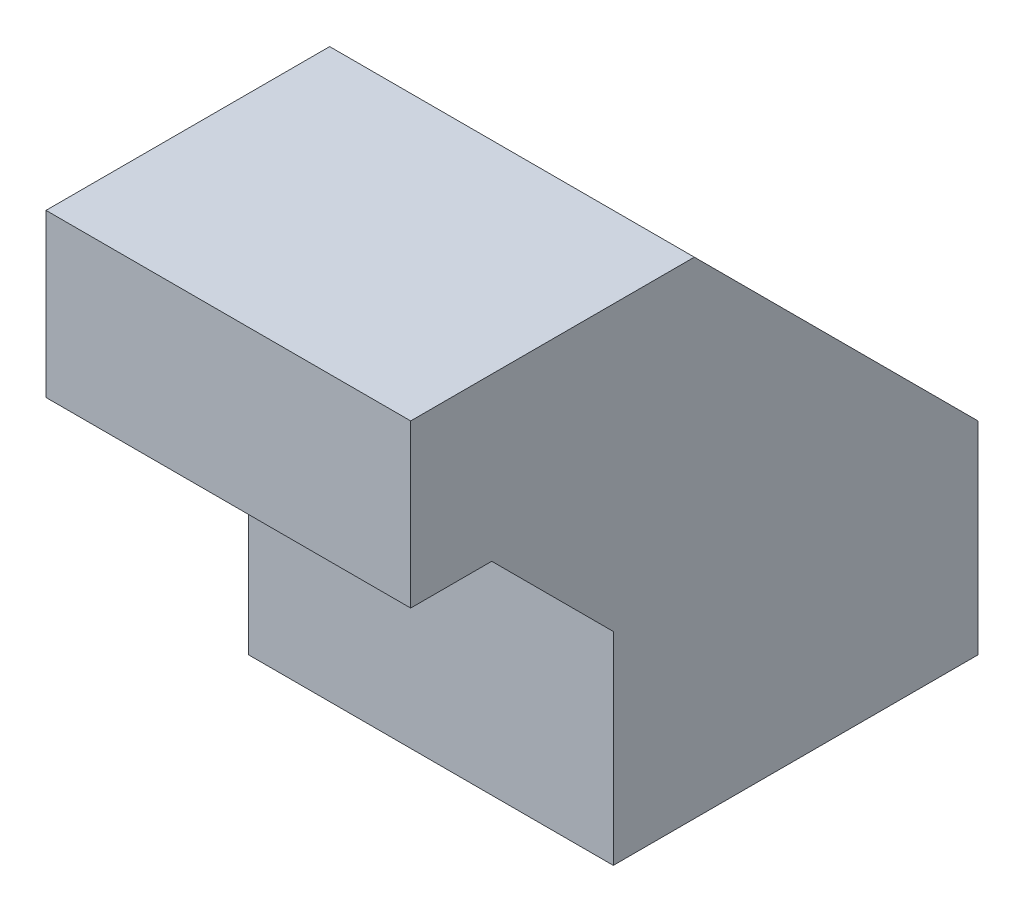
ISO-10303-21;
HEADER;
FILE_DESCRIPTION(('STEP AP214'),'2;1');
FILE_NAME('part.step','',(''),(''),'','','');
FILE_SCHEMA(('AUTOMOTIVE_DESIGN { 1 0 10303 214 1 1 1 1 }'));
ENDSEC;
DATA;
#1=APPLICATION_CONTEXT('core data for automotive mechanical design processes');
#2=APPLICATION_PROTOCOL_DEFINITION('international standard','automotive_design',2000,#1);
#3=PRODUCT_CONTEXT('',#1,'mechanical');
#4=PRODUCT('Part','Part','',(#3));
#5=PRODUCT_RELATED_PRODUCT_CATEGORY('part','',(#4));
#6=PRODUCT_DEFINITION_FORMATION('','',#4);
#7=PRODUCT_DEFINITION_CONTEXT('part definition',#1,'design');
#8=PRODUCT_DEFINITION('design','',#6,#7);
#9=PRODUCT_DEFINITION_SHAPE('','',#8);
#10=(LENGTH_UNIT() NAMED_UNIT(*) SI_UNIT(.MILLI.,.METRE.));
#11=(NAMED_UNIT(*) PLANE_ANGLE_UNIT() SI_UNIT($,.RADIAN.));
#12=(NAMED_UNIT(*) SI_UNIT($,.STERADIAN.) SOLID_ANGLE_UNIT());
#13=UNCERTAINTY_MEASURE_WITH_UNIT(LENGTH_MEASURE(1.E-05),#10,'distance_accuracy_value','');
#14=(GEOMETRIC_REPRESENTATION_CONTEXT(3) GLOBAL_UNCERTAINTY_ASSIGNED_CONTEXT((#13)) GLOBAL_UNIT_ASSIGNED_CONTEXT((#10,
#11,#12)) REPRESENTATION_CONTEXT('',''));
#15=CARTESIAN_POINT('',(0.,0.,0.));
#16=DIRECTION('',(0.,0.,1.));
#17=DIRECTION('',(1.,0.,0.));
#18=AXIS2_PLACEMENT_3D('',#15,#16,#17);
#19=CARTESIAN_POINT('',(0.,25.,0.));
#20=DIRECTION('',(0.,-1.,0.));
#21=DIRECTION('',(0.,0.,-1.));
#22=AXIS2_PLACEMENT_3D('',#19,#20,#21);
#23=CYLINDRICAL_SURFACE('',#22,20.);
#24=CARTESIAN_POINT('',(0.,0.,0.));
#25=DIRECTION('',(0.,1.,0.));
#26=DIRECTION('',(0.,0.,1.));
#27=AXIS2_PLACEMENT_3D('',#24,#25,#26);
#28=CIRCLE('',#27,20.);
#29=CARTESIAN_POINT('',(0.,0.,20.));
#30=VERTEX_POINT('',#29);
#31=EDGE_CURVE('E181',#30,#30,#28,.T.);
#32=ORIENTED_EDGE('',*,*,#31,.F.);
#33=EDGE_LOOP('',(#32));
#34=FACE_BOUND('',#33,.T.);
#35=CARTESIAN_POINT('',(0.,16.3873016277919,0.));
#36=DIRECTION('',(0.,0.707106781186548,-0.707106781186548));
#37=DIRECTION('',(0.,-0.707106781186548,-0.707106781186548));
#38=AXIS2_PLACEMENT_3D('',#35,#36,#37);
#39=ELLIPSE('',#38,28.2842712474619,20.);
#40=CARTESIAN_POINT('',(-18.8159302335193,9.60786437626905,-6.77943725152286));
#41=VERTEX_POINT('',#40);
#42=CARTESIAN_POINT('',(-20.,16.3873016277919,0.));
#43=VERTEX_POINT('',#42);
#44=EDGE_CURVE('E387',#41,#43,#39,.T.);
#45=ORIENTED_EDGE('',*,*,#44,.T.);
#46=CARTESIAN_POINT('',(-18.0505242790719,25.,8.61269837220809));
#47=VERTEX_POINT('',#46);
#48=EDGE_CURVE('E173',#43,#47,#39,.T.);
#49=ORIENTED_EDGE('',*,*,#48,.T.);
#50=CARTESIAN_POINT('',(0.,25.,0.));
#51=DIRECTION('',(0.,1.,0.));
#52=DIRECTION('',(0.,0.,1.));
#53=AXIS2_PLACEMENT_3D('',#50,#51,#52);
#54=CIRCLE('',#53,20.);
#55=CARTESIAN_POINT('',(18.0505242790719,25.,8.61269837220809));
#56=VERTEX_POINT('',#55);
#57=EDGE_CURVE('E182',#47,#56,#54,.T.);
#58=ORIENTED_EDGE('',*,*,#57,.T.);
#59=CARTESIAN_POINT('',(20.,16.3873016277919,0.));
#60=VERTEX_POINT('',#59);
#61=EDGE_CURVE('E55',#56,#60,#39,.T.);
#62=ORIENTED_EDGE('',*,*,#61,.T.);
#63=CARTESIAN_POINT('',(18.8159302335193,9.60786437626905,-6.77943725152286));
#64=VERTEX_POINT('',#63);
#65=EDGE_CURVE('E175',#60,#64,#39,.T.);
#66=ORIENTED_EDGE('',*,*,#65,.T.);
#67=CARTESIAN_POINT('',(0.,2.82842712474619,0.));
#68=DIRECTION('',(0.,0.707106781186547,0.707106781186548));
#69=DIRECTION('',(0.,-0.707106781186548,0.707106781186547));
#70=AXIS2_PLACEMENT_3D('',#67,#68,#69);
#71=ELLIPSE('',#70,28.2842712474619,20.);
#72=EDGE_CURVE('E11',#64,#41,#71,.T.);
#73=ORIENTED_EDGE('',*,*,#72,.T.);
#74=EDGE_LOOP('',(#45,#49,#58,#62,#66,#73));
#75=FACE_BOUND('',#74,.T.);
#76=ADVANCED_FACE('F33',(#34,#75),#23,.F.);
#77=CARTESIAN_POINT('',(0.,25.,0.));
#78=DIRECTION('',(0.,1.,0.));
#79=DIRECTION('',(0.,0.,1.));
#80=AXIS2_PLACEMENT_3D('',#77,#78,#79);
#81=PLANE('',#80);
#82=DIRECTION('',(-1.,0.,0.));
#83=VECTOR('',#82,1.);
#84=CARTESIAN_POINT('',(0.,25.,8.61269837220809));
#85=LINE('',#84,#83);
#86=EDGE_CURVE('E282',#56,#47,#85,.T.);
#87=ORIENTED_EDGE('',*,*,#86,.F.);
#88=ORIENTED_EDGE('',*,*,#57,.F.);
#89=EDGE_LOOP('',(#87,#88));
#90=FACE_BOUND('',#89,.T.);
#91=ADVANCED_FACE('F292',(#90),#81,.F.);
#92=CARTESIAN_POINT('',(22.5,40.,-22.5));
#93=DIRECTION('',(-1.,0.,0.));
#94=DIRECTION('',(0.,0.,1.));
#95=AXIS2_PLACEMENT_3D('',#92,#93,#94);
#96=PLANE('',#95);
#97=DIRECTION('',(0.,-1.,0.));
#98=VECTOR('',#97,1.);
#99=CARTESIAN_POINT('',(22.5,40.,-22.5));
#100=LINE('',#99,#98);
#101=CARTESIAN_POINT('',(22.5,24.9999999999999,-22.5));
#102=VERTEX_POINT('',#101);
#103=CARTESIAN_POINT('',(22.5,0.,-22.5));
#104=VERTEX_POINT('',#103);
#105=EDGE_CURVE('E211',#102,#104,#100,.T.);
#106=ORIENTED_EDGE('',*,*,#105,.F.);
#107=DIRECTION('',(0.,0.707106781186549,0.707106781186546));
#108=VECTOR('',#107,1.);
#109=CARTESIAN_POINT('',(22.5,60.,12.5));
#110=LINE('',#109,#108);
#111=CARTESIAN_POINT('',(22.5,60.,12.5));
#112=VERTEX_POINT('',#111);
#113=EDGE_CURVE('E280',#102,#112,#110,.T.);
#114=ORIENTED_EDGE('',*,*,#113,.T.);
#115=DIRECTION('',(0.,0.,-1.));
#116=VECTOR('',#115,1.);
#117=CARTESIAN_POINT('',(22.5,60.,-22.5));
#118=LINE('',#117,#116);
#119=CARTESIAN_POINT('',(22.5,60.,47.5));
#120=VERTEX_POINT('',#119);
#121=EDGE_CURVE('E193',#120,#112,#118,.T.);
#122=ORIENTED_EDGE('',*,*,#121,.F.);
#123=DIRECTION('',(0.,-1.,0.));
#124=VECTOR('',#123,1.);
#125=CARTESIAN_POINT('',(22.5,60.,47.5));
#126=LINE('',#125,#124);
#127=CARTESIAN_POINT('',(22.5,40.,47.5));
#128=VERTEX_POINT('',#127);
#129=EDGE_CURVE('E196',#120,#128,#126,.T.);
#130=ORIENTED_EDGE('',*,*,#129,.T.);
#131=DIRECTION('',(0.,0.,-1.));
#132=VECTOR('',#131,1.);
#133=CARTESIAN_POINT('',(22.5,40.,-22.5));
#134=LINE('',#133,#132);
#135=CARTESIAN_POINT('',(22.5,40.,37.5000000000001));
#136=VERTEX_POINT('',#135);
#137=EDGE_CURVE('E191',#128,#136,#134,.T.);
#138=ORIENTED_EDGE('',*,*,#137,.T.);
#139=DIRECTION('',(0.,0.707106781186544,0.707106781186551));
#140=VECTOR('',#139,1.);
#141=CARTESIAN_POINT('',(22.5,9.99999999999995,7.49999999999973));
#142=LINE('',#141,#140);
#143=CARTESIAN_POINT('',(22.5,25.0000000000001,22.5));
#144=VERTEX_POINT('',#143);
#145=EDGE_CURVE('E261',#136,#144,#142,.F.);
#146=ORIENTED_EDGE('',*,*,#145,.T.);
#147=DIRECTION('',(0.,-1.,0.));
#148=VECTOR('',#147,1.);
#149=CARTESIAN_POINT('',(22.5,40.,22.5));
#150=LINE('',#149,#148);
#151=CARTESIAN_POINT('',(22.5,0.,22.5));
#152=VERTEX_POINT('',#151);
#153=EDGE_CURVE('E212',#144,#152,#150,.T.);
#154=ORIENTED_EDGE('',*,*,#153,.T.);
#155=DIRECTION('',(0.,0.,-1.));
#156=VECTOR('',#155,1.);
#157=CARTESIAN_POINT('',(22.5,0.,-22.5));
#158=LINE('',#157,#156);
#159=EDGE_CURVE('E230',#152,#104,#158,.T.);
#160=ORIENTED_EDGE('',*,*,#159,.T.);
#161=EDGE_LOOP('',(#106,#114,#122,#130,#138,#146,#154,#160));
#162=FACE_BOUND('',#161,.T.);
#163=ADVANCED_FACE('F260',(#162),#96,.F.);
#164=CARTESIAN_POINT('',(-22.5,40.,-22.5));
#165=DIRECTION('',(0.,0.,1.));
#166=DIRECTION('',(1.,0.,0.));
#167=AXIS2_PLACEMENT_3D('',#164,#165,#166);
#168=PLANE('',#167);
#169=DIRECTION('',(0.,-1.,0.));
#170=VECTOR('',#169,1.);
#171=CARTESIAN_POINT('',(-22.5,40.,-22.5));
#172=LINE('',#171,#170);
#173=CARTESIAN_POINT('',(-22.5,24.9999999999999,-22.5));
#174=VERTEX_POINT('',#173);
#175=CARTESIAN_POINT('',(-22.5,0.,-22.5));
#176=VERTEX_POINT('',#175);
#177=EDGE_CURVE('E220',#174,#176,#172,.T.);
#178=ORIENTED_EDGE('',*,*,#177,.F.);
#179=DIRECTION('',(1.,0.,0.));
#180=VECTOR('',#179,1.);
#181=CARTESIAN_POINT('',(22.5,24.9999999999999,-22.5));
#182=LINE('',#181,#180);
#183=EDGE_CURVE('E278',#174,#102,#182,.T.);
#184=ORIENTED_EDGE('',*,*,#183,.T.);
#185=ORIENTED_EDGE('',*,*,#105,.T.);
#186=DIRECTION('',(-1.,0.,0.));
#187=VECTOR('',#186,1.);
#188=CARTESIAN_POINT('',(-22.5,0.,-22.5));
#189=LINE('',#188,#187);
#190=EDGE_CURVE('E227',#104,#176,#189,.T.);
#191=ORIENTED_EDGE('',*,*,#190,.T.);
#192=EDGE_LOOP('',(#178,#184,#185,#191));
#193=FACE_BOUND('',#192,.T.);
#194=ADVANCED_FACE('F326',(#193),#168,.F.);
#195=CARTESIAN_POINT('',(-22.5,40.,-22.5));
#196=DIRECTION('',(1.,0.,0.));
#197=DIRECTION('',(0.,0.,-1.));
#198=AXIS2_PLACEMENT_3D('',#195,#196,#197);
#199=PLANE('',#198);
#200=DIRECTION('',(0.,0.,1.));
#201=VECTOR('',#200,1.);
#202=CARTESIAN_POINT('',(-22.5,60.,-22.5));
#203=LINE('',#202,#201);
#204=CARTESIAN_POINT('',(-22.5,60.,12.5));
#205=VERTEX_POINT('',#204);
#206=CARTESIAN_POINT('',(-22.5,60.,47.5));
#207=VERTEX_POINT('',#206);
#208=EDGE_CURVE('E188',#205,#207,#203,.T.);
#209=ORIENTED_EDGE('',*,*,#208,.F.);
#210=DIRECTION('',(0.,-0.707106781186549,-0.707106781186546));
#211=VECTOR('',#210,1.);
#212=CARTESIAN_POINT('',(-22.5,60.,12.5));
#213=LINE('',#212,#211);
#214=EDGE_CURVE('E276',#205,#174,#213,.T.);
#215=ORIENTED_EDGE('',*,*,#214,.T.);
#216=ORIENTED_EDGE('',*,*,#177,.T.);
#217=DIRECTION('',(0.,0.,1.));
#218=VECTOR('',#217,1.);
#219=CARTESIAN_POINT('',(-22.5,0.,-22.5));
#220=LINE('',#219,#218);
#221=CARTESIAN_POINT('',(-22.5,0.,22.5));
#222=VERTEX_POINT('',#221);
#223=EDGE_CURVE('E224',#176,#222,#220,.T.);
#224=ORIENTED_EDGE('',*,*,#223,.T.);
#225=DIRECTION('',(0.,-1.,0.));
#226=VECTOR('',#225,1.);
#227=CARTESIAN_POINT('',(-22.5,40.,22.5));
#228=LINE('',#227,#226);
#229=CARTESIAN_POINT('',(-22.5,25.0000000000001,22.5));
#230=VERTEX_POINT('',#229);
#231=EDGE_CURVE('E214',#230,#222,#228,.T.);
#232=ORIENTED_EDGE('',*,*,#231,.F.);
#233=DIRECTION('',(0.,-0.707106781186544,-0.707106781186551));
#234=VECTOR('',#233,1.);
#235=CARTESIAN_POINT('',(-22.5,9.99999999999995,7.49999999999973));
#236=LINE('',#235,#234);
#237=CARTESIAN_POINT('',(-22.5,40.,37.5000000000001));
#238=VERTEX_POINT('',#237);
#239=EDGE_CURVE('E255',#230,#238,#236,.F.);
#240=ORIENTED_EDGE('',*,*,#239,.T.);
#241=DIRECTION('',(0.,0.,1.));
#242=VECTOR('',#241,1.);
#243=CARTESIAN_POINT('',(-22.5,40.,-22.5));
#244=LINE('',#243,#242);
#245=CARTESIAN_POINT('',(-22.5,40.,47.5));
#246=VERTEX_POINT('',#245);
#247=EDGE_CURVE('E202',#238,#246,#244,.T.);
#248=ORIENTED_EDGE('',*,*,#247,.T.);
#249=DIRECTION('',(0.,-1.,0.));
#250=VECTOR('',#249,1.);
#251=CARTESIAN_POINT('',(-22.5,60.,47.5));
#252=LINE('',#251,#250);
#253=EDGE_CURVE('E233',#207,#246,#252,.T.);
#254=ORIENTED_EDGE('',*,*,#253,.F.);
#255=EDGE_LOOP('',(#209,#215,#216,#224,#232,#240,#248,#254));
#256=FACE_BOUND('',#255,.T.);
#257=ADVANCED_FACE('F251',(#256),#199,.F.);
#258=CARTESIAN_POINT('',(-22.5,40.,22.5));
#259=DIRECTION('',(0.,0.,-1.));
#260=DIRECTION('',(-1.,0.,0.));
#261=AXIS2_PLACEMENT_3D('',#258,#259,#260);
#262=PLANE('',#261);
#263=ORIENTED_EDGE('',*,*,#153,.F.);
#264=DIRECTION('',(-1.,0.,0.));
#265=VECTOR('',#264,1.);
#266=CARTESIAN_POINT('',(-22.5,25.0000000000001,22.5));
#267=LINE('',#266,#265);
#268=EDGE_CURVE('E210',#144,#230,#267,.T.);
#269=ORIENTED_EDGE('',*,*,#268,.T.);
#270=ORIENTED_EDGE('',*,*,#231,.T.);
#271=DIRECTION('',(1.,0.,0.));
#272=VECTOR('',#271,1.);
#273=CARTESIAN_POINT('',(-22.5,0.,22.5));
#274=LINE('',#273,#272);
#275=EDGE_CURVE('E215',#222,#152,#274,.T.);
#276=ORIENTED_EDGE('',*,*,#275,.T.);
#277=EDGE_LOOP('',(#263,#269,#270,#276));
#278=FACE_BOUND('',#277,.T.);
#279=ADVANCED_FACE('F267',(#278),#262,.F.);
#280=CARTESIAN_POINT('',(0.,0.,0.));
#281=DIRECTION('',(0.,1.,0.));
#282=DIRECTION('',(0.,0.,1.));
#283=AXIS2_PLACEMENT_3D('',#280,#281,#282);
#284=PLANE('',#283);
#285=ORIENTED_EDGE('',*,*,#31,.T.);
#286=EDGE_LOOP('',(#285));
#287=FACE_BOUND('',#286,.T.);
#288=ORIENTED_EDGE('',*,*,#159,.F.);
#289=ORIENTED_EDGE('',*,*,#275,.F.);
#290=ORIENTED_EDGE('',*,*,#223,.F.);
#291=ORIENTED_EDGE('',*,*,#190,.F.);
#292=EDGE_LOOP('',(#288,#289,#290,#291));
#293=FACE_BOUND('',#292,.T.);
#294=ADVANCED_FACE('F316',(#287,#293),#284,.F.);
#295=CARTESIAN_POINT('',(0.,40.,0.));
#296=DIRECTION('',(0.,1.,0.));
#297=DIRECTION('',(0.,0.,1.));
#298=AXIS2_PLACEMENT_3D('',#295,#296,#297);
#299=PLANE('',#298);
#300=ORIENTED_EDGE('',*,*,#247,.F.);
#301=DIRECTION('',(1.,0.,0.));
#302=VECTOR('',#301,1.);
#303=CARTESIAN_POINT('',(22.5,40.,37.5000000000001));
#304=LINE('',#303,#302);
#305=EDGE_CURVE('E207',#238,#136,#304,.T.);
#306=ORIENTED_EDGE('',*,*,#305,.T.);
#307=ORIENTED_EDGE('',*,*,#137,.F.);
#308=DIRECTION('',(1.,0.,0.));
#309=VECTOR('',#308,1.);
#310=CARTESIAN_POINT('',(-22.5,40.,47.5));
#311=LINE('',#310,#309);
#312=EDGE_CURVE('E199',#246,#128,#311,.T.);
#313=ORIENTED_EDGE('',*,*,#312,.F.);
#314=EDGE_LOOP('',(#300,#306,#307,#313));
#315=FACE_BOUND('',#314,.T.);
#316=ADVANCED_FACE('F258',(#315),#299,.F.);
#317=CARTESIAN_POINT('',(-22.5,60.,47.5));
#318=DIRECTION('',(0.,0.,-1.));
#319=DIRECTION('',(-1.,0.,0.));
#320=AXIS2_PLACEMENT_3D('',#317,#318,#319);
#321=PLANE('',#320);
#322=ORIENTED_EDGE('',*,*,#312,.T.);
#323=ORIENTED_EDGE('',*,*,#129,.F.);
#324=DIRECTION('',(1.,0.,0.));
#325=VECTOR('',#324,1.);
#326=CARTESIAN_POINT('',(-22.5,60.,47.5));
#327=LINE('',#326,#325);
#328=EDGE_CURVE('E190',#207,#120,#327,.T.);
#329=ORIENTED_EDGE('',*,*,#328,.F.);
#330=ORIENTED_EDGE('',*,*,#253,.T.);
#331=EDGE_LOOP('',(#322,#323,#329,#330));
#332=FACE_BOUND('',#331,.T.);
#333=ADVANCED_FACE('F247',(#332),#321,.F.);
#334=CARTESIAN_POINT('',(0.,60.,0.));
#335=DIRECTION('',(0.,1.,0.));
#336=DIRECTION('',(0.,0.,1.));
#337=AXIS2_PLACEMENT_3D('',#334,#335,#336);
#338=PLANE('',#337);
#339=ORIENTED_EDGE('',*,*,#121,.T.);
#340=DIRECTION('',(-1.,0.,0.));
#341=VECTOR('',#340,1.);
#342=CARTESIAN_POINT('',(-22.5,60.,12.5));
#343=LINE('',#342,#341);
#344=EDGE_CURVE('E273',#112,#205,#343,.T.);
#345=ORIENTED_EDGE('',*,*,#344,.T.);
#346=ORIENTED_EDGE('',*,*,#208,.T.);
#347=ORIENTED_EDGE('',*,*,#328,.T.);
#348=EDGE_LOOP('',(#339,#345,#346,#347));
#349=FACE_BOUND('',#348,.T.);
#350=ADVANCED_FACE('F310',(#349),#338,.T.);
#351=CARTESIAN_POINT('',(0.,40.,37.5000000000001));
#352=DIRECTION('',(0.,-0.707106781186551,0.707106781186544));
#353=DIRECTION('',(-1.,0.,0.));
#354=AXIS2_PLACEMENT_3D('',#351,#352,#353);
#355=PLANE('',#354);
#356=ORIENTED_EDGE('',*,*,#239,.F.);
#357=ORIENTED_EDGE('',*,*,#268,.F.);
#358=ORIENTED_EDGE('',*,*,#145,.F.);
#359=ORIENTED_EDGE('',*,*,#305,.F.);
#360=EDGE_LOOP('',(#356,#357,#358,#359));
#361=FACE_BOUND('',#360,.T.);
#362=ADVANCED_FACE('F270',(#361),#355,.T.);
#363=CARTESIAN_POINT('',(0.,60.,12.5));
#364=DIRECTION('',(0.,0.707106781186546,-0.707106781186549));
#365=DIRECTION('',(1.,0.,0.));
#366=AXIS2_PLACEMENT_3D('',#363,#364,#365);
#367=PLANE('',#366);
#368=ORIENTED_EDGE('',*,*,#113,.F.);
#369=ORIENTED_EDGE('',*,*,#183,.F.);
#370=ORIENTED_EDGE('',*,*,#214,.F.);
#371=ORIENTED_EDGE('',*,*,#344,.F.);
#372=EDGE_LOOP('',(#368,#369,#370,#371));
#373=FACE_BOUND('',#372,.T.);
#374=ADVANCED_FACE('F35',(#373),#367,.T.);
#375=CARTESIAN_POINT('',(20.,44.2560966544099,27.868795026618));
#376=DIRECTION('',(0.,0.707106781186548,-0.707106781186548));
#377=DIRECTION('',(0.,0.707106781186548,0.707106781186548));
#378=AXIS2_PLACEMENT_3D('',#375,#376,#377);
#379=PLANE('',#378);
#380=DIRECTION('',(0.,-0.707106781186548,-0.707106781186548));
#381=VECTOR('',#380,1.);
#382=CARTESIAN_POINT('',(20.,44.2560966544099,27.868795026618));
#383=LINE('',#382,#381);
#384=CARTESIAN_POINT('',(20.,9.60786437626905,-6.77943725152286));
#385=VERTEX_POINT('',#384);
#386=EDGE_CURVE('E371',#60,#385,#383,.T.);
#387=ORIENTED_EDGE('',*,*,#386,.T.);
#388=DIRECTION('',(1.,0.,0.));
#389=VECTOR('',#388,1.);
#390=CARTESIAN_POINT('',(20.,9.60786437626905,-6.77943725152286));
#391=LINE('',#390,#389);
#392=EDGE_CURVE('E382',#64,#385,#391,.T.);
#393=ORIENTED_EDGE('',*,*,#392,.F.);
#394=ORIENTED_EDGE('',*,*,#65,.F.);
#395=EDGE_LOOP('',(#387,#393,#394));
#396=FACE_BOUND('',#395,.T.);
#397=ADVANCED_FACE('F335',(#396),#379,.T.);
#398=CARTESIAN_POINT('',(-20.,9.60786437626905,-6.77943725152286));
#399=VERTEX_POINT('',#398);
#400=EDGE_CURVE('E167',#399,#41,#391,.T.);
#401=ORIENTED_EDGE('',*,*,#400,.F.);
#402=DIRECTION('',(0.,-0.707106781186548,-0.707106781186548));
#403=VECTOR('',#402,1.);
#404=CARTESIAN_POINT('',(-20.,44.2560966544099,27.868795026618));
#405=LINE('',#404,#403);
#406=EDGE_CURVE('E370',#43,#399,#405,.T.);
#407=ORIENTED_EDGE('',*,*,#406,.F.);
#408=ORIENTED_EDGE('',*,*,#44,.F.);
#409=EDGE_LOOP('',(#401,#407,#408));
#410=FACE_BOUND('',#409,.T.);
#411=ADVANCED_FACE('F340',(#410),#379,.T.);
#412=CARTESIAN_POINT('',(20.,44.2560966544099,27.868795026618));
#413=DIRECTION('',(-1.,0.,0.));
#414=DIRECTION('',(0.,0.,1.));
#415=AXIS2_PLACEMENT_3D('',#412,#413,#414);
#416=PLANE('',#415);
#417=ORIENTED_EDGE('',*,*,#386,.F.);
#418=CARTESIAN_POINT('',(20.,44.2560966544099,27.868795026618));
#419=VERTEX_POINT('',#418);
#420=EDGE_CURVE('E166',#419,#60,#383,.T.);
#421=ORIENTED_EDGE('',*,*,#420,.F.);
#422=DIRECTION('',(0.,0.707106781186548,-0.707106781186547));
#423=VECTOR('',#422,1.);
#424=CARTESIAN_POINT('',(20.,44.2560966544099,27.868795026618));
#425=LINE('',#424,#423);
#426=CARTESIAN_POINT('',(20.,58.3982322781408,13.726659402887));
#427=VERTEX_POINT('',#426);
#428=EDGE_CURVE('E151',#419,#427,#425,.T.);
#429=ORIENTED_EDGE('',*,*,#428,.T.);
#430=DIRECTION('',(0.,-0.707106781186548,-0.707106781186548));
#431=VECTOR('',#430,1.);
#432=CARTESIAN_POINT('',(20.,58.3982322781408,13.726659402887));
#433=LINE('',#432,#431);
#434=CARTESIAN_POINT('',(20.,23.75,-20.9215728752538));
#435=VERTEX_POINT('',#434);
#436=EDGE_CURVE('E164',#427,#435,#433,.T.);
#437=ORIENTED_EDGE('',*,*,#436,.T.);
#438=DIRECTION('',(0.,0.707106781186548,-0.707106781186547));
#439=VECTOR('',#438,1.);
#440=CARTESIAN_POINT('',(20.,9.60786437626905,-6.77943725152286));
#441=LINE('',#440,#439);
#442=EDGE_CURVE('E376',#385,#435,#441,.T.);
#443=ORIENTED_EDGE('',*,*,#442,.F.);
#444=EDGE_LOOP('',(#417,#421,#429,#437,#443));
#445=FACE_BOUND('',#444,.T.);
#446=ADVANCED_FACE('F162',(#445),#416,.T.);
#447=CARTESIAN_POINT('',(20.,58.3982322781408,13.726659402887));
#448=DIRECTION('',(0.,-0.707106781186548,0.707106781186548));
#449=DIRECTION('',(0.,-0.707106781186548,-0.707106781186548));
#450=AXIS2_PLACEMENT_3D('',#447,#448,#449);
#451=PLANE('',#450);
#452=DIRECTION('',(1.,0.,0.));
#453=VECTOR('',#452,1.);
#454=CARTESIAN_POINT('',(0.,25.,-19.6715728752538));
#455=LINE('',#454,#453);
#456=CARTESIAN_POINT('',(-3.60960117098533,25.,-19.6715728752538));
#457=VERTEX_POINT('',#456);
#458=CARTESIAN_POINT('',(3.60960117098533,25.,-19.6715728752538));
#459=VERTEX_POINT('',#458);
#460=EDGE_CURVE('E41',#457,#459,#455,.T.);
#461=ORIENTED_EDGE('',*,*,#460,.T.);
#462=CARTESIAN_POINT('',(0.,44.6715728752538,0.));
#463=DIRECTION('',(0.,-0.707106781186548,0.707106781186548));
#464=DIRECTION('',(0.,-0.707106781186548,-0.707106781186548));
#465=AXIS2_PLACEMENT_3D('',#462,#463,#464);
#466=ELLIPSE('',#465,28.2842712474619,20.);
#467=EDGE_CURVE('E47',#457,#459,#466,.T.);
#468=ORIENTED_EDGE('',*,*,#467,.F.);
#469=EDGE_LOOP('',(#461,#468));
#470=FACE_BOUND('',#469,.T.);
#471=DIRECTION('',(-1.,0.,0.));
#472=VECTOR('',#471,1.);
#473=CARTESIAN_POINT('',(20.,23.75,-20.9215728752538));
#474=LINE('',#473,#472);
#475=CARTESIAN_POINT('',(-20.,23.75,-20.9215728752538));
#476=VERTEX_POINT('',#475);
#477=EDGE_CURVE('E170',#435,#476,#474,.T.);
#478=ORIENTED_EDGE('',*,*,#477,.F.);
#479=ORIENTED_EDGE('',*,*,#436,.F.);
#480=DIRECTION('',(-1.,0.,0.));
#481=VECTOR('',#480,1.);
#482=CARTESIAN_POINT('',(20.,58.3982322781408,13.726659402887));
#483=LINE('',#482,#481);
#484=CARTESIAN_POINT('',(-20.,58.3982322781408,13.726659402887));
#485=VERTEX_POINT('',#484);
#486=EDGE_CURVE('E147',#427,#485,#483,.T.);
#487=ORIENTED_EDGE('',*,*,#486,.T.);
#488=DIRECTION('',(0.,-0.707106781186548,-0.707106781186548));
#489=VECTOR('',#488,1.);
#490=CARTESIAN_POINT('',(-20.,58.3982322781408,13.726659402887));
#491=LINE('',#490,#489);
#492=EDGE_CURVE('E171',#485,#476,#491,.T.);
#493=ORIENTED_EDGE('',*,*,#492,.T.);
#494=EDGE_LOOP('',(#478,#479,#487,#493));
#495=FACE_BOUND('',#494,.T.);
#496=ADVANCED_FACE('F169',(#470,#495),#451,.T.);
#497=CARTESIAN_POINT('',(-20.,44.2560966544099,27.868795026618));
#498=DIRECTION('',(1.,0.,0.));
#499=DIRECTION('',(0.,0.,-1.));
#500=AXIS2_PLACEMENT_3D('',#497,#498,#499);
#501=PLANE('',#500);
#502=CARTESIAN_POINT('',(-20.,44.2560966544099,27.868795026618));
#503=VERTEX_POINT('',#502);
#504=EDGE_CURVE('E176',#503,#43,#405,.T.);
#505=ORIENTED_EDGE('',*,*,#504,.T.);
#506=ORIENTED_EDGE('',*,*,#406,.T.);
#507=DIRECTION('',(0.,-0.707106781186548,0.707106781186547));
#508=VECTOR('',#507,1.);
#509=CARTESIAN_POINT('',(-20.,9.60786437626905,-6.77943725152286));
#510=LINE('',#509,#508);
#511=EDGE_CURVE('E379',#476,#399,#510,.T.);
#512=ORIENTED_EDGE('',*,*,#511,.F.);
#513=ORIENTED_EDGE('',*,*,#492,.F.);
#514=DIRECTION('',(0.,-0.707106781186548,0.707106781186547));
#515=VECTOR('',#514,1.);
#516=CARTESIAN_POINT('',(-20.,44.2560966544099,27.868795026618));
#517=LINE('',#516,#515);
#518=EDGE_CURVE('E152',#485,#503,#517,.T.);
#519=ORIENTED_EDGE('',*,*,#518,.T.);
#520=EDGE_LOOP('',(#505,#506,#512,#513,#519));
#521=FACE_BOUND('',#520,.T.);
#522=ADVANCED_FACE('F357',(#521),#501,.T.);
#523=ORIENTED_EDGE('',*,*,#504,.F.);
#524=DIRECTION('',(1.,0.,0.));
#525=VECTOR('',#524,1.);
#526=CARTESIAN_POINT('',(20.,44.2560966544099,27.868795026618));
#527=LINE('',#526,#525);
#528=EDGE_CURVE('E366',#503,#419,#527,.T.);
#529=ORIENTED_EDGE('',*,*,#528,.T.);
#530=ORIENTED_EDGE('',*,*,#420,.T.);
#531=ORIENTED_EDGE('',*,*,#61,.F.);
#532=ORIENTED_EDGE('',*,*,#86,.T.);
#533=ORIENTED_EDGE('',*,*,#48,.F.);
#534=EDGE_LOOP('',(#523,#529,#530,#531,#532,#533));
#535=FACE_BOUND('',#534,.T.);
#536=ADVANCED_FACE('F343',(#535),#379,.T.);
#537=CARTESIAN_POINT('',(0.,36.0624458405139,36.0624458405139));
#538=DIRECTION('',(0.,0.707106781186547,0.707106781186548));
#539=DIRECTION('',(0.,-0.707106781186548,0.707106781186547));
#540=AXIS2_PLACEMENT_3D('',#537,#538,#539);
#541=PLANE('',#540);
#542=ORIENTED_EDGE('',*,*,#428,.F.);
#543=ORIENTED_EDGE('',*,*,#528,.F.);
#544=ORIENTED_EDGE('',*,*,#518,.F.);
#545=ORIENTED_EDGE('',*,*,#486,.F.);
#546=EDGE_LOOP('',(#542,#543,#544,#545));
#547=FACE_BOUND('',#546,.T.);
#548=ADVANCED_FACE('F149',(#547),#541,.F.);
#549=CARTESIAN_POINT('',(0.,1.4142135623731,1.4142135623731));
#550=DIRECTION('',(0.,0.707106781186547,0.707106781186548));
#551=DIRECTION('',(0.,-0.707106781186548,0.707106781186547));
#552=AXIS2_PLACEMENT_3D('',#549,#550,#551);
#553=PLANE('',#552);
#554=ORIENTED_EDGE('',*,*,#392,.T.);
#555=ORIENTED_EDGE('',*,*,#442,.T.);
#556=ORIENTED_EDGE('',*,*,#477,.T.);
#557=ORIENTED_EDGE('',*,*,#511,.T.);
#558=ORIENTED_EDGE('',*,*,#400,.T.);
#559=ORIENTED_EDGE('',*,*,#72,.F.);
#560=EDGE_LOOP('',(#554,#555,#556,#557,#558,#559));
#561=FACE_BOUND('',#560,.T.);
#562=ADVANCED_FACE('F290',(#561),#553,.T.);
#563=ORIENTED_EDGE('',*,*,#460,.F.);
#564=EDGE_CURVE('E185',#459,#457,#54,.T.);
#565=ORIENTED_EDGE('',*,*,#564,.F.);
#566=EDGE_LOOP('',(#563,#565));
#567=FACE_BOUND('',#566,.T.);
#568=ADVANCED_FACE('F288',(#567),#81,.F.);
#569=ORIENTED_EDGE('',*,*,#564,.T.);
#570=ORIENTED_EDGE('',*,*,#467,.T.);
#571=EDGE_LOOP('',(#569,#570));
#572=FACE_BOUND('',#571,.T.);
#573=ADVANCED_FACE('F287',(#572),#23,.F.);
#574=CLOSED_SHELL('',(#76,#91,#163,#194,#257,#279,#294,#316,#333,#350,#362,#374,#397,#411,#446,
#496,#522,#536,#548,#562,#568,#573));
#575=MANIFOLD_SOLID_BREP('B2',#574);
#576=ADVANCED_BREP_SHAPE_REPRESENTATION('',(#18,#575),#14);
#577=SHAPE_DEFINITION_REPRESENTATION(#9,#576);
ENDSEC;
END-ISO-10303-21;
